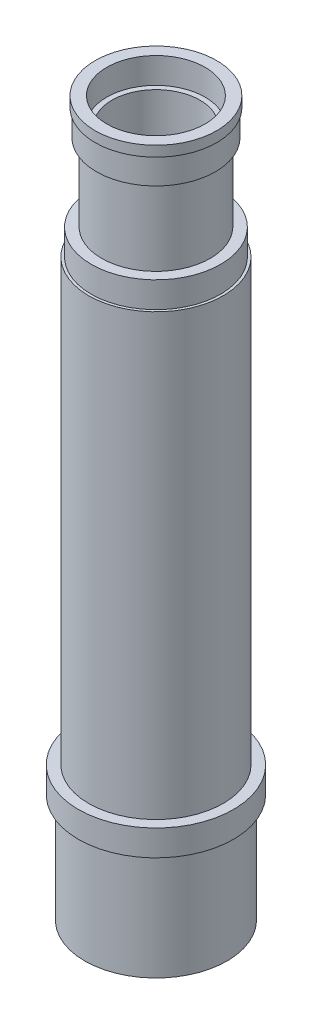
ISO-10303-21;
HEADER;
FILE_DESCRIPTION(('STEP AP214'),'2;1');
FILE_NAME('part.step','',(''),(''),'','','');
FILE_SCHEMA(('AUTOMOTIVE_DESIGN { 1 0 10303 214 1 1 1 1 }'));
ENDSEC;
DATA;
#1=APPLICATION_CONTEXT('core data for automotive mechanical design processes');
#2=APPLICATION_PROTOCOL_DEFINITION('international standard','automotive_design',2000,#1);
#3=PRODUCT_CONTEXT('',#1,'mechanical');
#4=PRODUCT('Part','Part','',(#3));
#5=PRODUCT_RELATED_PRODUCT_CATEGORY('part','',(#4));
#6=PRODUCT_DEFINITION_FORMATION('','',#4);
#7=PRODUCT_DEFINITION_CONTEXT('part definition',#1,'design');
#8=PRODUCT_DEFINITION('design','',#6,#7);
#9=PRODUCT_DEFINITION_SHAPE('','',#8);
#10=(LENGTH_UNIT() NAMED_UNIT(*) SI_UNIT(.MILLI.,.METRE.));
#11=(NAMED_UNIT(*) PLANE_ANGLE_UNIT() SI_UNIT($,.RADIAN.));
#12=(NAMED_UNIT(*) SI_UNIT($,.STERADIAN.) SOLID_ANGLE_UNIT());
#13=UNCERTAINTY_MEASURE_WITH_UNIT(LENGTH_MEASURE(1.E-05),#10,'distance_accuracy_value','');
#14=(GEOMETRIC_REPRESENTATION_CONTEXT(3) GLOBAL_UNCERTAINTY_ASSIGNED_CONTEXT((#13)) GLOBAL_UNIT_ASSIGNED_CONTEXT((#10,
#11,#12)) REPRESENTATION_CONTEXT('',''));
#15=CARTESIAN_POINT('',(0.,0.,0.));
#16=DIRECTION('',(0.,0.,1.));
#17=DIRECTION('',(1.,0.,0.));
#18=AXIS2_PLACEMENT_3D('',#15,#16,#17);
#19=CARTESIAN_POINT('',(0.,-35.5838190768799,15.));
#20=DIRECTION('',(0.,1.,0.));
#21=DIRECTION('',(0.,0.,1.));
#22=AXIS2_PLACEMENT_3D('',#19,#20,#21);
#23=PLANE('',#22);
#24=CARTESIAN_POINT('',(0.,-35.5838190768799,0.));
#25=DIRECTION('',(0.,1.,0.));
#26=DIRECTION('',(0.,0.,1.));
#27=AXIS2_PLACEMENT_3D('',#24,#25,#26);
#28=CIRCLE('',#27,11.);
#29=CARTESIAN_POINT('',(0.,-35.5838190768799,11.));
#30=VERTEX_POINT('',#29);
#31=EDGE_CURVE('E49',#30,#30,#28,.F.);
#32=ORIENTED_EDGE('',*,*,#31,.T.);
#33=EDGE_LOOP('',(#32));
#34=FACE_BOUND('',#33,.T.);
#35=CARTESIAN_POINT('',(0.,-35.5838190768799,0.));
#36=DIRECTION('',(0.,1.,0.));
#37=DIRECTION('',(0.,0.,1.));
#38=AXIS2_PLACEMENT_3D('',#35,#36,#37);
#39=CIRCLE('',#38,15.);
#40=CARTESIAN_POINT('',(0.,-35.5838190768799,15.));
#41=VERTEX_POINT('',#40);
#42=EDGE_CURVE('E65',#41,#41,#39,.T.);
#43=ORIENTED_EDGE('',*,*,#42,.T.);
#44=EDGE_LOOP('',(#43));
#45=FACE_BOUND('',#44,.T.);
#46=ADVANCED_FACE('F45',(#34,#45),#23,.T.);
#47=CARTESIAN_POINT('',(0.,74.4161809231202,0.));
#48=DIRECTION('',(0.,1.,0.));
#49=DIRECTION('',(0.,0.,1.));
#50=AXIS2_PLACEMENT_3D('',#47,#48,#49);
#51=CYLINDRICAL_SURFACE('',#50,11.75);
#52=CARTESIAN_POINT('',(0.,-61.5838190768799,0.));
#53=DIRECTION('',(0.,1.,0.));
#54=DIRECTION('',(0.,0.,1.));
#55=AXIS2_PLACEMENT_3D('',#52,#53,#54);
#56=CIRCLE('',#55,11.75);
#57=CARTESIAN_POINT('',(0.,-61.5838190768799,11.75));
#58=VERTEX_POINT('',#57);
#59=EDGE_CURVE('E77',#58,#58,#56,.T.);
#60=ORIENTED_EDGE('',*,*,#59,.F.);
#61=EDGE_LOOP('',(#60));
#62=FACE_BOUND('',#61,.T.);
#63=CARTESIAN_POINT('',(0.,-38.5838190768799,0.));
#64=DIRECTION('',(0.,1.,0.));
#65=DIRECTION('',(0.,0.,1.));
#66=AXIS2_PLACEMENT_3D('',#63,#64,#65);
#67=CIRCLE('',#66,11.75);
#68=CARTESIAN_POINT('',(0.,-38.5838190768799,11.75));
#69=VERTEX_POINT('',#68);
#70=EDGE_CURVE('E12',#69,#69,#67,.T.);
#71=ORIENTED_EDGE('',*,*,#70,.T.);
#72=EDGE_LOOP('',(#71));
#73=FACE_BOUND('',#72,.T.);
#74=ADVANCED_FACE('F101',(#62,#73),#51,.F.);
#75=CARTESIAN_POINT('',(11.75,-38.5838190768799,0.));
#76=DIRECTION('',(0.,-1.,0.));
#77=DIRECTION('',(0.,0.,-1.));
#78=AXIS2_PLACEMENT_3D('',#75,#76,#77);
#79=PLANE('',#78);
#80=ORIENTED_EDGE('',*,*,#70,.F.);
#81=EDGE_LOOP('',(#80));
#82=FACE_BOUND('',#81,.T.);
#83=CARTESIAN_POINT('',(0.,-38.5838190768799,0.));
#84=DIRECTION('',(0.,1.,0.));
#85=DIRECTION('',(0.,0.,1.));
#86=AXIS2_PLACEMENT_3D('',#83,#84,#85);
#87=CIRCLE('',#86,13.);
#88=CARTESIAN_POINT('',(0.,-38.5838190768799,13.));
#89=VERTEX_POINT('',#88);
#90=EDGE_CURVE('E53',#89,#89,#87,.T.);
#91=ORIENTED_EDGE('',*,*,#90,.T.);
#92=EDGE_LOOP('',(#91));
#93=FACE_BOUND('',#92,.T.);
#94=ADVANCED_FACE('F103',(#82,#93),#79,.F.);
#95=CARTESIAN_POINT('',(0.,74.4161809231202,0.));
#96=DIRECTION('',(0.,1.,0.));
#97=DIRECTION('',(0.,0.,1.));
#98=AXIS2_PLACEMENT_3D('',#95,#96,#97);
#99=CYLINDRICAL_SURFACE('',#98,13.);
#100=ORIENTED_EDGE('',*,*,#90,.F.);
#101=EDGE_LOOP('',(#100));
#102=FACE_BOUND('',#101,.T.);
#103=CARTESIAN_POINT('',(0.,-37.5838190768799,0.));
#104=DIRECTION('',(0.,1.,0.));
#105=DIRECTION('',(0.,0.,1.));
#106=AXIS2_PLACEMENT_3D('',#103,#104,#105);
#107=CIRCLE('',#106,13.);
#108=CARTESIAN_POINT('',(0.,-37.5838190768799,13.));
#109=VERTEX_POINT('',#108);
#110=EDGE_CURVE('E57',#109,#109,#107,.T.);
#111=ORIENTED_EDGE('',*,*,#110,.T.);
#112=EDGE_LOOP('',(#111));
#113=FACE_BOUND('',#112,.T.);
#114=ADVANCED_FACE('F97',(#102,#113),#99,.F.);
#115=CARTESIAN_POINT('',(13.,-37.5838190768799,0.));
#116=DIRECTION('',(0.,1.,0.));
#117=DIRECTION('',(0.,0.,1.));
#118=AXIS2_PLACEMENT_3D('',#115,#116,#117);
#119=PLANE('',#118);
#120=ORIENTED_EDGE('',*,*,#110,.F.);
#121=EDGE_LOOP('',(#120));
#122=FACE_BOUND('',#121,.T.);
#123=CARTESIAN_POINT('',(0.,-37.5838190768799,0.));
#124=DIRECTION('',(0.,1.,0.));
#125=DIRECTION('',(0.,0.,1.));
#126=AXIS2_PLACEMENT_3D('',#123,#124,#125);
#127=CIRCLE('',#126,11.);
#128=CARTESIAN_POINT('',(0.,-37.5838190768799,11.));
#129=VERTEX_POINT('',#128);
#130=EDGE_CURVE('E62',#129,#129,#127,.T.);
#131=ORIENTED_EDGE('',*,*,#130,.T.);
#132=EDGE_LOOP('',(#131));
#133=FACE_BOUND('',#132,.T.);
#134=ADVANCED_FACE('F88',(#122,#133),#119,.F.);
#135=CARTESIAN_POINT('',(0.,74.4161809231202,0.));
#136=DIRECTION('',(0.,1.,0.));
#137=DIRECTION('',(0.,0.,1.));
#138=AXIS2_PLACEMENT_3D('',#135,#136,#137);
#139=CYLINDRICAL_SURFACE('',#138,11.);
#140=ORIENTED_EDGE('',*,*,#130,.F.);
#141=EDGE_LOOP('',(#140));
#142=FACE_BOUND('',#141,.T.);
#143=ORIENTED_EDGE('',*,*,#31,.F.);
#144=EDGE_LOOP('',(#143));
#145=FACE_BOUND('',#144,.T.);
#146=ADVANCED_FACE('F47',(#142,#145),#139,.F.);
#147=CARTESIAN_POINT('',(11.75,-61.5838190768799,0.));
#148=DIRECTION('',(0.,1.,0.));
#149=DIRECTION('',(0.,0.,1.));
#150=AXIS2_PLACEMENT_3D('',#147,#148,#149);
#151=PLANE('',#150);
#152=CARTESIAN_POINT('',(0.,-61.5838190768799,0.));
#153=DIRECTION('',(0.,1.,0.));
#154=DIRECTION('',(0.,0.,1.));
#155=AXIS2_PLACEMENT_3D('',#152,#153,#154);
#156=CIRCLE('',#155,13.75);
#157=CARTESIAN_POINT('',(0.,-61.5838190768799,13.75));
#158=VERTEX_POINT('',#157);
#159=EDGE_CURVE('E74',#158,#158,#156,.T.);
#160=ORIENTED_EDGE('',*,*,#159,.F.);
#161=EDGE_LOOP('',(#160));
#162=FACE_BOUND('',#161,.T.);
#163=ORIENTED_EDGE('',*,*,#59,.T.);
#164=EDGE_LOOP('',(#163));
#165=FACE_BOUND('',#164,.T.);
#166=ADVANCED_FACE('F87',(#162,#165),#151,.F.);
#167=CARTESIAN_POINT('',(0.,74.4161809231202,0.));
#168=DIRECTION('',(0.,1.,0.));
#169=DIRECTION('',(0.,0.,1.));
#170=AXIS2_PLACEMENT_3D('',#167,#168,#169);
#171=CYLINDRICAL_SURFACE('',#170,13.75);
#172=CARTESIAN_POINT('',(0.,-40.5838190768799,0.));
#173=DIRECTION('',(0.,1.,0.));
#174=DIRECTION('',(0.,0.,1.));
#175=AXIS2_PLACEMENT_3D('',#172,#173,#174);
#176=CIRCLE('',#175,13.75);
#177=CARTESIAN_POINT('',(0.,-40.5838190768799,13.75));
#178=VERTEX_POINT('',#177);
#179=EDGE_CURVE('E71',#178,#178,#176,.T.);
#180=ORIENTED_EDGE('',*,*,#179,.F.);
#181=EDGE_LOOP('',(#180));
#182=FACE_BOUND('',#181,.T.);
#183=ORIENTED_EDGE('',*,*,#159,.T.);
#184=EDGE_LOOP('',(#183));
#185=FACE_BOUND('',#184,.T.);
#186=ADVANCED_FACE('F94',(#182,#185),#171,.T.);
#187=CARTESIAN_POINT('',(13.75,-40.5838190768799,0.));
#188=DIRECTION('',(0.,1.,0.));
#189=DIRECTION('',(0.,0.,1.));
#190=AXIS2_PLACEMENT_3D('',#187,#188,#189);
#191=PLANE('',#190);
#192=CARTESIAN_POINT('',(0.,-40.5838190768799,0.));
#193=DIRECTION('',(0.,1.,0.));
#194=DIRECTION('',(0.,0.,1.));
#195=AXIS2_PLACEMENT_3D('',#192,#193,#194);
#196=CIRCLE('',#195,15.);
#197=CARTESIAN_POINT('',(0.,-40.5838190768799,15.));
#198=VERTEX_POINT('',#197);
#199=EDGE_CURVE('E68',#198,#198,#196,.T.);
#200=ORIENTED_EDGE('',*,*,#199,.F.);
#201=EDGE_LOOP('',(#200));
#202=FACE_BOUND('',#201,.T.);
#203=ORIENTED_EDGE('',*,*,#179,.T.);
#204=EDGE_LOOP('',(#203));
#205=FACE_BOUND('',#204,.T.);
#206=ADVANCED_FACE('F119',(#202,#205),#191,.F.);
#207=CARTESIAN_POINT('',(0.,74.4161809231202,0.));
#208=DIRECTION('',(0.,1.,0.));
#209=DIRECTION('',(0.,0.,1.));
#210=AXIS2_PLACEMENT_3D('',#207,#208,#209);
#211=CYLINDRICAL_SURFACE('',#210,15.);
#212=ORIENTED_EDGE('',*,*,#42,.F.);
#213=EDGE_LOOP('',(#212));
#214=FACE_BOUND('',#213,.T.);
#215=ORIENTED_EDGE('',*,*,#199,.T.);
#216=EDGE_LOOP('',(#215));
#217=FACE_BOUND('',#216,.T.);
#218=ADVANCED_FACE('F112',(#214,#217),#211,.T.);
#219=CLOSED_SHELL('',(#46,#74,#94,#114,#134,#146,#166,#186,#206,#218));
#220=MANIFOLD_SOLID_BREP('B2',#219);
#221=CARTESIAN_POINT('',(0.,49.4161809231201,13.));
#222=DIRECTION('',(0.,1.,0.));
#223=DIRECTION('',(0.,0.,1.));
#224=AXIS2_PLACEMENT_3D('',#221,#222,#223);
#225=PLANE('',#224);
#226=CARTESIAN_POINT('',(0.,49.4161809231201,0.));
#227=DIRECTION('',(0.,1.,0.));
#228=DIRECTION('',(0.,0.,1.));
#229=AXIS2_PLACEMENT_3D('',#226,#227,#228);
#230=CIRCLE('',#229,10.5);
#231=CARTESIAN_POINT('',(0.,49.4161809231201,10.5));
#232=VERTEX_POINT('',#231);
#233=EDGE_CURVE('E213',#232,#232,#230,.F.);
#234=ORIENTED_EDGE('',*,*,#233,.F.);
#235=EDGE_LOOP('',(#234));
#236=FACE_BOUND('',#235,.T.);
#237=CARTESIAN_POINT('',(0.,49.4161809231201,0.));
#238=DIRECTION('',(0.,1.,0.));
#239=DIRECTION('',(0.,0.,1.));
#240=AXIS2_PLACEMENT_3D('',#237,#238,#239);
#241=CIRCLE('',#240,12.5);
#242=CARTESIAN_POINT('',(0.,49.4161809231201,12.5));
#243=VERTEX_POINT('',#242);
#244=EDGE_CURVE('E225',#243,#243,#241,.T.);
#245=ORIENTED_EDGE('',*,*,#244,.F.);
#246=EDGE_LOOP('',(#245));
#247=FACE_BOUND('',#246,.T.);
#248=ADVANCED_FACE('F209',(#236,#247),#225,.F.);
#249=CARTESIAN_POINT('',(0.,74.4161809231202,0.));
#250=DIRECTION('',(0.,1.,0.));
#251=DIRECTION('',(0.,0.,1.));
#252=AXIS2_PLACEMENT_3D('',#249,#250,#251);
#253=CYLINDRICAL_SURFACE('',#252,11.75);
#254=CARTESIAN_POINT('',(0.,76.4161809231202,0.));
#255=DIRECTION('',(0.,1.,0.));
#256=DIRECTION('',(0.,0.,1.));
#257=AXIS2_PLACEMENT_3D('',#254,#255,#256);
#258=CIRCLE('',#257,11.75);
#259=CARTESIAN_POINT('',(0.,76.4161809231202,11.75));
#260=VERTEX_POINT('',#259);
#261=EDGE_CURVE('E307',#260,#260,#258,.T.);
#262=ORIENTED_EDGE('',*,*,#261,.F.);
#263=EDGE_LOOP('',(#262));
#264=FACE_BOUND('',#263,.T.);
#265=CARTESIAN_POINT('',(0.,74.4161809231202,0.));
#266=DIRECTION('',(0.,1.,0.));
#267=DIRECTION('',(0.,0.,1.));
#268=AXIS2_PLACEMENT_3D('',#265,#266,#267);
#269=CIRCLE('',#268,11.75);
#270=CARTESIAN_POINT('',(0.,74.4161809231202,11.75));
#271=VERTEX_POINT('',#270);
#272=EDGE_CURVE('E310',#271,#271,#269,.T.);
#273=ORIENTED_EDGE('',*,*,#272,.T.);
#274=EDGE_LOOP('',(#273));
#275=FACE_BOUND('',#274,.T.);
#276=ADVANCED_FACE('F239',(#264,#275),#253,.T.);
#277=CARTESIAN_POINT('',(9.5,76.4161809231202,0.));
#278=DIRECTION('',(0.,-1.,0.));
#279=DIRECTION('',(0.,0.,-1.));
#280=AXIS2_PLACEMENT_3D('',#277,#278,#279);
#281=PLANE('',#280);
#282=CARTESIAN_POINT('',(0.,76.4161809231202,0.));
#283=DIRECTION('',(0.,1.,0.));
#284=DIRECTION('',(0.,0.,1.));
#285=AXIS2_PLACEMENT_3D('',#282,#283,#284);
#286=CIRCLE('',#285,9.5);
#287=CARTESIAN_POINT('',(0.,76.4161809231202,9.5));
#288=VERTEX_POINT('',#287);
#289=EDGE_CURVE('E302',#288,#288,#286,.T.);
#290=ORIENTED_EDGE('',*,*,#289,.F.);
#291=EDGE_LOOP('',(#290));
#292=FACE_BOUND('',#291,.T.);
#293=ORIENTED_EDGE('',*,*,#261,.T.);
#294=EDGE_LOOP('',(#293));
#295=FACE_BOUND('',#294,.T.);
#296=ADVANCED_FACE('F244',(#292,#295),#281,.F.);
#297=CARTESIAN_POINT('',(0.,74.4161809231202,0.));
#298=DIRECTION('',(0.,1.,0.));
#299=DIRECTION('',(0.,0.,1.));
#300=AXIS2_PLACEMENT_3D('',#297,#298,#299);
#301=CYLINDRICAL_SURFACE('',#300,9.5);
#302=CARTESIAN_POINT('',(0.,71.4161809231202,0.));
#303=DIRECTION('',(0.,1.,0.));
#304=DIRECTION('',(0.,0.,1.));
#305=AXIS2_PLACEMENT_3D('',#302,#303,#304);
#306=CIRCLE('',#305,9.5);
#307=CARTESIAN_POINT('',(0.,71.4161809231202,9.5));
#308=VERTEX_POINT('',#307);
#309=EDGE_CURVE('E300',#308,#308,#306,.T.);
#310=ORIENTED_EDGE('',*,*,#309,.F.);
#311=EDGE_LOOP('',(#310));
#312=FACE_BOUND('',#311,.T.);
#313=ORIENTED_EDGE('',*,*,#289,.T.);
#314=EDGE_LOOP('',(#313));
#315=FACE_BOUND('',#314,.T.);
#316=ADVANCED_FACE('F277',(#312,#315),#301,.F.);
#317=CARTESIAN_POINT('',(8.5,71.4161809231202,0.));
#318=DIRECTION('',(0.,-1.,0.));
#319=DIRECTION('',(0.,0.,-1.));
#320=AXIS2_PLACEMENT_3D('',#317,#318,#319);
#321=PLANE('',#320);
#322=CARTESIAN_POINT('',(0.,71.4161809231202,0.));
#323=DIRECTION('',(0.,1.,0.));
#324=DIRECTION('',(0.,0.,1.));
#325=AXIS2_PLACEMENT_3D('',#322,#323,#324);
#326=CIRCLE('',#325,8.5);
#327=CARTESIAN_POINT('',(0.,71.4161809231202,8.5));
#328=VERTEX_POINT('',#327);
#329=EDGE_CURVE('E222',#328,#328,#326,.T.);
#330=ORIENTED_EDGE('',*,*,#329,.F.);
#331=EDGE_LOOP('',(#330));
#332=FACE_BOUND('',#331,.T.);
#333=ORIENTED_EDGE('',*,*,#309,.T.);
#334=EDGE_LOOP('',(#333));
#335=FACE_BOUND('',#334,.T.);
#336=ADVANCED_FACE('F281',(#332,#335),#321,.F.);
#337=CARTESIAN_POINT('',(0.,74.4161809231202,0.));
#338=DIRECTION('',(0.,1.,0.));
#339=DIRECTION('',(0.,0.,1.));
#340=AXIS2_PLACEMENT_3D('',#337,#338,#339);
#341=CYLINDRICAL_SURFACE('',#340,8.5);
#342=CARTESIAN_POINT('',(0.,52.4161809231201,0.));
#343=DIRECTION('',(0.,1.,0.));
#344=DIRECTION('',(0.,0.,1.));
#345=AXIS2_PLACEMENT_3D('',#342,#343,#344);
#346=CIRCLE('',#345,8.5);
#347=CARTESIAN_POINT('',(0.,52.4161809231201,8.5));
#348=VERTEX_POINT('',#347);
#349=EDGE_CURVE('E217',#348,#348,#346,.T.);
#350=ORIENTED_EDGE('',*,*,#349,.F.);
#351=EDGE_LOOP('',(#350));
#352=FACE_BOUND('',#351,.T.);
#353=ORIENTED_EDGE('',*,*,#329,.T.);
#354=EDGE_LOOP('',(#353));
#355=FACE_BOUND('',#354,.T.);
#356=ADVANCED_FACE('F285',(#352,#355),#341,.F.);
#357=CARTESIAN_POINT('',(10.5,52.4161809231201,0.));
#358=DIRECTION('',(0.,1.,0.));
#359=DIRECTION('',(0.,0.,1.));
#360=AXIS2_PLACEMENT_3D('',#357,#358,#359);
#361=PLANE('',#360);
#362=CARTESIAN_POINT('',(0.,52.4161809231201,0.));
#363=DIRECTION('',(0.,1.,0.));
#364=DIRECTION('',(0.,0.,1.));
#365=AXIS2_PLACEMENT_3D('',#362,#363,#364);
#366=CIRCLE('',#365,10.5);
#367=CARTESIAN_POINT('',(0.,52.4161809231201,10.5));
#368=VERTEX_POINT('',#367);
#369=EDGE_CURVE('E44',#368,#368,#366,.T.);
#370=ORIENTED_EDGE('',*,*,#369,.F.);
#371=EDGE_LOOP('',(#370));
#372=FACE_BOUND('',#371,.T.);
#373=ORIENTED_EDGE('',*,*,#349,.T.);
#374=EDGE_LOOP('',(#373));
#375=FACE_BOUND('',#374,.T.);
#376=ADVANCED_FACE('F288',(#372,#375),#361,.F.);
#377=CARTESIAN_POINT('',(0.,74.4161809231202,0.));
#378=DIRECTION('',(0.,1.,0.));
#379=DIRECTION('',(0.,0.,1.));
#380=AXIS2_PLACEMENT_3D('',#377,#378,#379);
#381=CYLINDRICAL_SURFACE('',#380,10.5);
#382=ORIENTED_EDGE('',*,*,#233,.T.);
#383=EDGE_LOOP('',(#382));
#384=FACE_BOUND('',#383,.T.);
#385=ORIENTED_EDGE('',*,*,#369,.T.);
#386=EDGE_LOOP('',(#385));
#387=FACE_BOUND('',#386,.T.);
#388=ADVANCED_FACE('F211',(#384,#387),#381,.F.);
#389=CARTESIAN_POINT('',(11.5,74.4161809231202,0.));
#390=DIRECTION('',(0.,1.,0.));
#391=DIRECTION('',(0.,0.,1.));
#392=AXIS2_PLACEMENT_3D('',#389,#390,#391);
#393=PLANE('',#392);
#394=ORIENTED_EDGE('',*,*,#272,.F.);
#395=EDGE_LOOP('',(#394));
#396=FACE_BOUND('',#395,.T.);
#397=CARTESIAN_POINT('',(0.,74.4161809231202,0.));
#398=DIRECTION('',(0.,1.,0.));
#399=DIRECTION('',(0.,0.,1.));
#400=AXIS2_PLACEMENT_3D('',#397,#398,#399);
#401=CIRCLE('',#400,11.5);
#402=CARTESIAN_POINT('',(0.,74.4161809231202,11.5));
#403=VERTEX_POINT('',#402);
#404=EDGE_CURVE('E313',#403,#403,#401,.T.);
#405=ORIENTED_EDGE('',*,*,#404,.T.);
#406=EDGE_LOOP('',(#405));
#407=FACE_BOUND('',#406,.T.);
#408=ADVANCED_FACE('F270',(#396,#407),#393,.F.);
#409=CARTESIAN_POINT('',(0.,74.4161809231202,0.));
#410=DIRECTION('',(0.,1.,0.));
#411=DIRECTION('',(0.,0.,1.));
#412=AXIS2_PLACEMENT_3D('',#409,#410,#411);
#413=CYLINDRICAL_SURFACE('',#412,11.5);
#414=ORIENTED_EDGE('',*,*,#404,.F.);
#415=EDGE_LOOP('',(#414));
#416=FACE_BOUND('',#415,.T.);
#417=CARTESIAN_POINT('',(0.,69.4161809231201,0.));
#418=DIRECTION('',(0.,1.,0.));
#419=DIRECTION('',(0.,0.,1.));
#420=AXIS2_PLACEMENT_3D('',#417,#418,#419);
#421=CIRCLE('',#420,11.5);
#422=CARTESIAN_POINT('',(0.,69.4161809231201,11.5));
#423=VERTEX_POINT('',#422);
#424=EDGE_CURVE('E316',#423,#423,#421,.T.);
#425=ORIENTED_EDGE('',*,*,#424,.T.);
#426=EDGE_LOOP('',(#425));
#427=FACE_BOUND('',#426,.T.);
#428=ADVANCED_FACE('F266',(#416,#427),#413,.T.);
#429=CARTESIAN_POINT('',(10.5,69.4161809231201,0.));
#430=DIRECTION('',(0.,1.,0.));
#431=DIRECTION('',(0.,0.,1.));
#432=AXIS2_PLACEMENT_3D('',#429,#430,#431);
#433=PLANE('',#432);
#434=ORIENTED_EDGE('',*,*,#424,.F.);
#435=EDGE_LOOP('',(#434));
#436=FACE_BOUND('',#435,.T.);
#437=CARTESIAN_POINT('',(0.,69.4161809231201,0.));
#438=DIRECTION('',(0.,1.,0.));
#439=DIRECTION('',(0.,0.,1.));
#440=AXIS2_PLACEMENT_3D('',#437,#438,#439);
#441=CIRCLE('',#440,10.5);
#442=CARTESIAN_POINT('',(0.,69.4161809231201,10.5));
#443=VERTEX_POINT('',#442);
#444=EDGE_CURVE('E319',#443,#443,#441,.T.);
#445=ORIENTED_EDGE('',*,*,#444,.T.);
#446=EDGE_LOOP('',(#445));
#447=FACE_BOUND('',#446,.T.);
#448=ADVANCED_FACE('F262',(#436,#447),#433,.F.);
#449=CARTESIAN_POINT('',(0.,74.4161809231202,0.));
#450=DIRECTION('',(0.,1.,0.));
#451=DIRECTION('',(0.,0.,1.));
#452=AXIS2_PLACEMENT_3D('',#449,#450,#451);
#453=CYLINDRICAL_SURFACE('',#452,10.5);
#454=ORIENTED_EDGE('',*,*,#444,.F.);
#455=EDGE_LOOP('',(#454));
#456=FACE_BOUND('',#455,.T.);
#457=CARTESIAN_POINT('',(0.,54.4161809231201,0.));
#458=DIRECTION('',(0.,1.,0.));
#459=DIRECTION('',(0.,0.,1.));
#460=AXIS2_PLACEMENT_3D('',#457,#458,#459);
#461=CIRCLE('',#460,10.5);
#462=CARTESIAN_POINT('',(0.,54.4161809231201,10.5));
#463=VERTEX_POINT('',#462);
#464=EDGE_CURVE('E231',#463,#463,#461,.T.);
#465=ORIENTED_EDGE('',*,*,#464,.T.);
#466=EDGE_LOOP('',(#465));
#467=FACE_BOUND('',#466,.T.);
#468=ADVANCED_FACE('F255',(#456,#467),#453,.T.);
#469=CARTESIAN_POINT('',(12.5,54.4161809231201,0.));
#470=DIRECTION('',(0.,-1.,0.));
#471=DIRECTION('',(0.,0.,-1.));
#472=AXIS2_PLACEMENT_3D('',#469,#470,#471);
#473=PLANE('',#472);
#474=ORIENTED_EDGE('',*,*,#464,.F.);
#475=EDGE_LOOP('',(#474));
#476=FACE_BOUND('',#475,.T.);
#477=CARTESIAN_POINT('',(0.,54.4161809231201,0.));
#478=DIRECTION('',(0.,1.,0.));
#479=DIRECTION('',(0.,0.,1.));
#480=AXIS2_PLACEMENT_3D('',#477,#478,#479);
#481=CIRCLE('',#480,12.5);
#482=CARTESIAN_POINT('',(0.,54.4161809231201,12.5));
#483=VERTEX_POINT('',#482);
#484=EDGE_CURVE('E227',#483,#483,#481,.T.);
#485=ORIENTED_EDGE('',*,*,#484,.T.);
#486=EDGE_LOOP('',(#485));
#487=FACE_BOUND('',#486,.T.);
#488=ADVANCED_FACE('F249',(#476,#487),#473,.F.);
#489=CARTESIAN_POINT('',(0.,74.4161809231202,0.));
#490=DIRECTION('',(0.,1.,0.));
#491=DIRECTION('',(0.,0.,1.));
#492=AXIS2_PLACEMENT_3D('',#489,#490,#491);
#493=CYLINDRICAL_SURFACE('',#492,12.5);
#494=ORIENTED_EDGE('',*,*,#484,.F.);
#495=EDGE_LOOP('',(#494));
#496=FACE_BOUND('',#495,.T.);
#497=ORIENTED_EDGE('',*,*,#244,.T.);
#498=EDGE_LOOP('',(#497));
#499=FACE_BOUND('',#498,.T.);
#500=ADVANCED_FACE('F240',(#496,#499),#493,.T.);
#501=CLOSED_SHELL('',(#248,#276,#296,#316,#336,#356,#376,#388,#408,#428,#448,#468,#488,#500));
#502=MANIFOLD_SOLID_BREP('B7',#501);
#503=CARTESIAN_POINT('',(0.,-35.5838190768799,15.));
#504=DIRECTION('',(0.,1.,0.));
#505=DIRECTION('',(0.,0.,1.));
#506=AXIS2_PLACEMENT_3D('',#503,#504,#505);
#507=PLANE('',#506);
#508=CARTESIAN_POINT('',(0.,-35.5838190768799,0.));
#509=DIRECTION('',(0.,1.,0.));
#510=DIRECTION('',(0.,0.,1.));
#511=AXIS2_PLACEMENT_3D('',#508,#509,#510);
#512=CIRCLE('',#511,11.);
#513=CARTESIAN_POINT('',(0.,-35.5838190768799,11.));
#514=VERTEX_POINT('',#513);
#515=EDGE_CURVE('E426',#514,#514,#512,.F.);
#516=ORIENTED_EDGE('',*,*,#515,.F.);
#517=EDGE_LOOP('',(#516));
#518=FACE_BOUND('',#517,.T.);
#519=CARTESIAN_POINT('',(0.,-35.5838190768799,0.));
#520=DIRECTION('',(0.,1.,0.));
#521=DIRECTION('',(0.,0.,1.));
#522=AXIS2_PLACEMENT_3D('',#519,#520,#521);
#523=CIRCLE('',#522,13.);
#524=CARTESIAN_POINT('',(0.,-35.5838190768799,13.));
#525=VERTEX_POINT('',#524);
#526=EDGE_CURVE('E430',#525,#525,#523,.T.);
#527=ORIENTED_EDGE('',*,*,#526,.F.);
#528=EDGE_LOOP('',(#527));
#529=FACE_BOUND('',#528,.T.);
#530=ADVANCED_FACE('F420',(#518,#529),#507,.F.);
#531=CARTESIAN_POINT('',(11.,47.4161809231201,0.));
#532=DIRECTION('',(0.,1.,0.));
#533=DIRECTION('',(0.,0.,1.));
#534=AXIS2_PLACEMENT_3D('',#531,#532,#533);
#535=PLANE('',#534);
#536=CARTESIAN_POINT('',(0.,47.4161809231201,0.));
#537=DIRECTION('',(0.,1.,0.));
#538=DIRECTION('',(0.,0.,1.));
#539=AXIS2_PLACEMENT_3D('',#536,#537,#538);
#540=CIRCLE('',#539,11.);
#541=CARTESIAN_POINT('',(0.,47.4161809231201,11.));
#542=VERTEX_POINT('',#541);
#543=EDGE_CURVE('E442',#542,#542,#540,.T.);
#544=ORIENTED_EDGE('',*,*,#543,.F.);
#545=EDGE_LOOP('',(#544));
#546=FACE_BOUND('',#545,.T.);
#547=CARTESIAN_POINT('',(0.,47.4161809231201,0.));
#548=DIRECTION('',(0.,1.,0.));
#549=DIRECTION('',(0.,0.,1.));
#550=AXIS2_PLACEMENT_3D('',#547,#548,#549);
#551=CIRCLE('',#550,10.5);
#552=CARTESIAN_POINT('',(0.,47.4161809231201,10.5));
#553=VERTEX_POINT('',#552);
#554=EDGE_CURVE('E439',#553,#553,#551,.T.);
#555=ORIENTED_EDGE('',*,*,#554,.T.);
#556=EDGE_LOOP('',(#555));
#557=FACE_BOUND('',#556,.T.);
#558=ADVANCED_FACE('F448',(#546,#557),#535,.F.);
#559=CARTESIAN_POINT('',(0.,74.4161809231202,0.));
#560=DIRECTION('',(0.,1.,0.));
#561=DIRECTION('',(0.,0.,1.));
#562=AXIS2_PLACEMENT_3D('',#559,#560,#561);
#563=CYLINDRICAL_SURFACE('',#562,11.);
#564=ORIENTED_EDGE('',*,*,#515,.T.);
#565=EDGE_LOOP('',(#564));
#566=FACE_BOUND('',#565,.T.);
#567=ORIENTED_EDGE('',*,*,#543,.T.);
#568=EDGE_LOOP('',(#567));
#569=FACE_BOUND('',#568,.T.);
#570=ADVANCED_FACE('F446',(#566,#569),#563,.F.);
#571=CARTESIAN_POINT('',(0.,74.4161809231202,0.));
#572=DIRECTION('',(0.,1.,0.));
#573=DIRECTION('',(0.,0.,1.));
#574=AXIS2_PLACEMENT_3D('',#571,#572,#573);
#575=CYLINDRICAL_SURFACE('',#574,10.5);
#576=ORIENTED_EDGE('',*,*,#554,.F.);
#577=EDGE_LOOP('',(#576));
#578=FACE_BOUND('',#577,.T.);
#579=CARTESIAN_POINT('',(0.,49.4161809231201,0.));
#580=DIRECTION('',(0.,1.,0.));
#581=DIRECTION('',(0.,0.,1.));
#582=AXIS2_PLACEMENT_3D('',#579,#580,#581);
#583=CIRCLE('',#582,10.5);
#584=CARTESIAN_POINT('',(0.,49.4161809231201,10.5));
#585=VERTEX_POINT('',#584);
#586=EDGE_CURVE('E208',#585,#585,#583,.F.);
#587=ORIENTED_EDGE('',*,*,#586,.F.);
#588=EDGE_LOOP('',(#587));
#589=FACE_BOUND('',#588,.T.);
#590=ADVANCED_FACE('F454',(#578,#589),#575,.F.);
#591=CARTESIAN_POINT('',(13.,49.4161809231201,0.));
#592=DIRECTION('',(0.,-1.,0.));
#593=DIRECTION('',(0.,0.,-1.));
#594=AXIS2_PLACEMENT_3D('',#591,#592,#593);
#595=PLANE('',#594);
#596=CARTESIAN_POINT('',(0.,49.4161809231201,0.));
#597=DIRECTION('',(0.,1.,0.));
#598=DIRECTION('',(0.,0.,1.));
#599=AXIS2_PLACEMENT_3D('',#596,#597,#598);
#600=CIRCLE('',#599,13.);
#601=CARTESIAN_POINT('',(0.,49.4161809231201,13.));
#602=VERTEX_POINT('',#601);
#603=EDGE_CURVE('E434',#602,#602,#600,.T.);
#604=ORIENTED_EDGE('',*,*,#603,.T.);
#605=EDGE_LOOP('',(#604));
#606=FACE_BOUND('',#605,.T.);
#607=ORIENTED_EDGE('',*,*,#586,.T.);
#608=EDGE_LOOP('',(#607));
#609=FACE_BOUND('',#608,.T.);
#610=ADVANCED_FACE('F457',(#606,#609),#595,.F.);
#611=CARTESIAN_POINT('',(0.,74.4161809231202,0.));
#612=DIRECTION('',(0.,1.,0.));
#613=DIRECTION('',(0.,0.,1.));
#614=AXIS2_PLACEMENT_3D('',#611,#612,#613);
#615=CYLINDRICAL_SURFACE('',#614,13.);
#616=ORIENTED_EDGE('',*,*,#603,.F.);
#617=EDGE_LOOP('',(#616));
#618=FACE_BOUND('',#617,.T.);
#619=ORIENTED_EDGE('',*,*,#526,.T.);
#620=EDGE_LOOP('',(#619));
#621=FACE_BOUND('',#620,.T.);
#622=ADVANCED_FACE('F463',(#618,#621),#615,.T.);
#623=CLOSED_SHELL('',(#530,#558,#570,#590,#610,#622));
#624=MANIFOLD_SOLID_BREP('B39',#623);
#625=ADVANCED_BREP_SHAPE_REPRESENTATION('',(#18,#220,#502,#624),#14);
#626=SHAPE_DEFINITION_REPRESENTATION(#9,#625);
ENDSEC;
END-ISO-10303-21;
